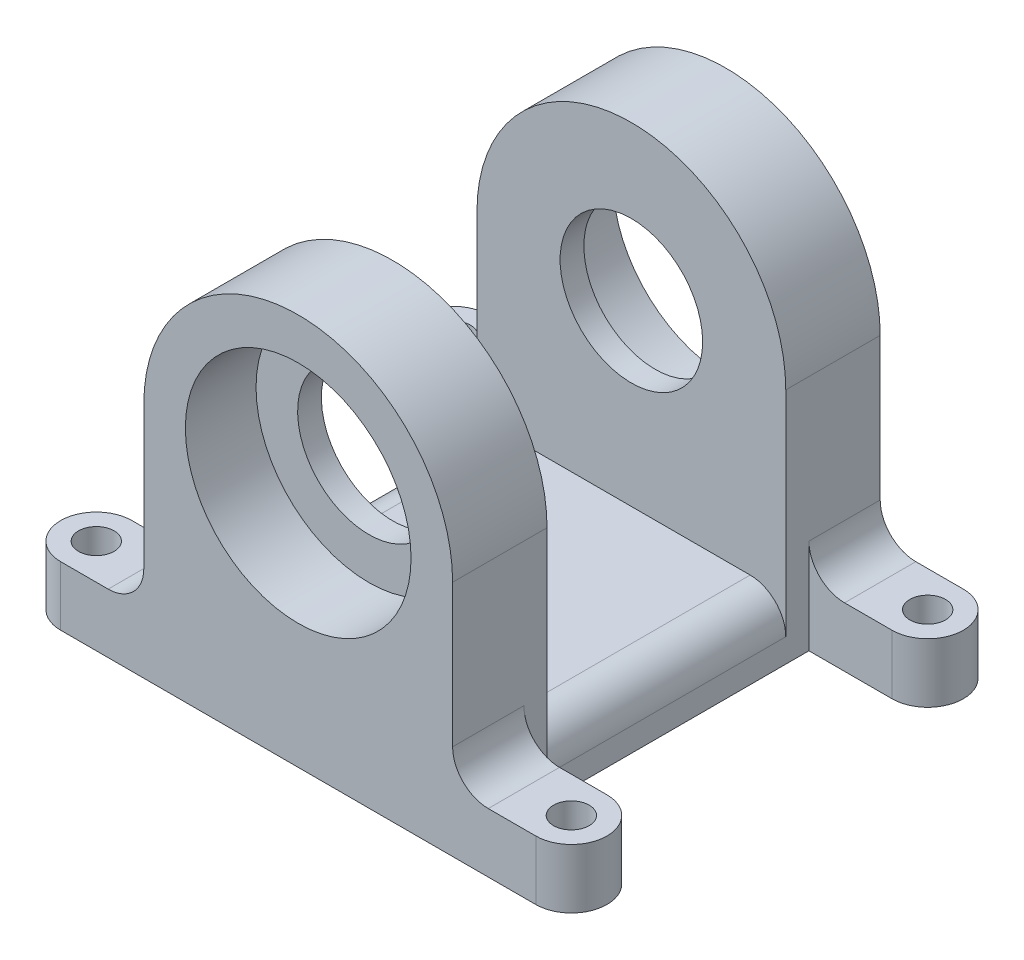
ISO-10303-21;
HEADER;
FILE_DESCRIPTION(('STEP AP214'),'2;1');
FILE_NAME('part.step','',(''),(''),'','','');
FILE_SCHEMA(('AUTOMOTIVE_DESIGN { 1 0 10303 214 1 1 1 1 }'));
ENDSEC;
DATA;
#1=APPLICATION_CONTEXT('core data for automotive mechanical design processes');
#2=APPLICATION_PROTOCOL_DEFINITION('international standard','automotive_design',2000,#1);
#3=PRODUCT_CONTEXT('',#1,'mechanical');
#4=PRODUCT('Part','Part','',(#3));
#5=PRODUCT_RELATED_PRODUCT_CATEGORY('part','',(#4));
#6=PRODUCT_DEFINITION_FORMATION('','',#4);
#7=PRODUCT_DEFINITION_CONTEXT('part definition',#1,'design');
#8=PRODUCT_DEFINITION('design','',#6,#7);
#9=PRODUCT_DEFINITION_SHAPE('','',#8);
#10=(LENGTH_UNIT() NAMED_UNIT(*) SI_UNIT(.MILLI.,.METRE.));
#11=(NAMED_UNIT(*) PLANE_ANGLE_UNIT() SI_UNIT($,.RADIAN.));
#12=(NAMED_UNIT(*) SI_UNIT($,.STERADIAN.) SOLID_ANGLE_UNIT());
#13=UNCERTAINTY_MEASURE_WITH_UNIT(LENGTH_MEASURE(1.E-05),#10,'distance_accuracy_value','');
#14=(GEOMETRIC_REPRESENTATION_CONTEXT(3) GLOBAL_UNCERTAINTY_ASSIGNED_CONTEXT((#13)) GLOBAL_UNIT_ASSIGNED_CONTEXT((#10,
#11,#12)) REPRESENTATION_CONTEXT('',''));
#15=CARTESIAN_POINT('',(0.,0.,0.));
#16=DIRECTION('',(0.,0.,1.));
#17=DIRECTION('',(1.,0.,0.));
#18=AXIS2_PLACEMENT_3D('',#15,#16,#17);
#19=CARTESIAN_POINT('',(0.,0.,36.));
#20=DIRECTION('',(0.,0.,-1.));
#21=DIRECTION('',(-1.,0.,0.));
#22=AXIS2_PLACEMENT_3D('',#19,#20,#21);
#23=CYLINDRICAL_SURFACE('',#22,9.5);
#24=CARTESIAN_POINT('',(0.,0.,0.));
#25=DIRECTION('',(0.,0.,1.));
#26=DIRECTION('',(1.,0.,0.));
#27=AXIS2_PLACEMENT_3D('',#24,#25,#26);
#28=CIRCLE('',#27,9.5);
#29=CARTESIAN_POINT('',(9.5,0.,0.));
#30=VERTEX_POINT('',#29);
#31=EDGE_CURVE('E345',#30,#30,#28,.T.);
#32=ORIENTED_EDGE('',*,*,#31,.F.);
#33=EDGE_LOOP('',(#32));
#34=FACE_BOUND('',#33,.T.);
#35=CARTESIAN_POINT('',(0.,0.,5.95));
#36=DIRECTION('',(0.,0.,1.));
#37=DIRECTION('',(1.,0.,0.));
#38=AXIS2_PLACEMENT_3D('',#35,#36,#37);
#39=CIRCLE('',#38,9.5);
#40=CARTESIAN_POINT('',(9.5,0.,5.95));
#41=VERTEX_POINT('',#40);
#42=EDGE_CURVE('E314',#41,#41,#39,.T.);
#43=ORIENTED_EDGE('',*,*,#42,.T.);
#44=EDGE_LOOP('',(#43));
#45=FACE_BOUND('',#44,.T.);
#46=ADVANCED_FACE('F39',(#34,#45),#23,.F.);
#47=CARTESIAN_POINT('',(0.,0.,36.));
#48=DIRECTION('',(0.,0.,1.));
#49=DIRECTION('',(1.,0.,0.));
#50=AXIS2_PLACEMENT_3D('',#47,#48,#49);
#51=CIRCLE('',#50,9.5);
#52=CARTESIAN_POINT('',(9.5,0.,36.));
#53=VERTEX_POINT('',#52);
#54=EDGE_CURVE('E346',#53,#53,#51,.T.);
#55=ORIENTED_EDGE('',*,*,#54,.T.);
#56=EDGE_LOOP('',(#55));
#57=FACE_BOUND('',#56,.T.);
#58=CARTESIAN_POINT('',(0.,0.,30.05));
#59=DIRECTION('',(0.,0.,-1.));
#60=DIRECTION('',(0.,1.,0.));
#61=AXIS2_PLACEMENT_3D('',#58,#59,#60);
#62=CIRCLE('',#61,9.5);
#63=CARTESIAN_POINT('',(0.,9.49999999999999,30.05));
#64=VERTEX_POINT('',#63);
#65=EDGE_CURVE('E323',#64,#64,#62,.T.);
#66=ORIENTED_EDGE('',*,*,#65,.T.);
#67=EDGE_LOOP('',(#66));
#68=FACE_BOUND('',#67,.T.);
#69=ADVANCED_FACE('F513',(#57,#68),#23,.F.);
#70=CARTESIAN_POINT('',(0.,0.,36.));
#71=DIRECTION('',(0.,0.,-1.));
#72=DIRECTION('',(-1.,0.,0.));
#73=AXIS2_PLACEMENT_3D('',#70,#71,#72);
#74=CYLINDRICAL_SURFACE('',#73,13.);
#75=DIRECTION('',(0.,0.,-1.));
#76=VECTOR('',#75,1.);
#77=CARTESIAN_POINT('',(13.,0.,36.));
#78=LINE('',#77,#76);
#79=CARTESIAN_POINT('',(13.,0.,36.));
#80=VERTEX_POINT('',#79);
#81=CARTESIAN_POINT('',(13.,0.,28.05));
#82=VERTEX_POINT('',#81);
#83=EDGE_CURVE('E371',#80,#82,#78,.T.);
#84=ORIENTED_EDGE('',*,*,#83,.T.);
#85=CARTESIAN_POINT('',(0.,0.,28.05));
#86=DIRECTION('',(0.,0.,1.));
#87=DIRECTION('',(0.,-1.,0.));
#88=AXIS2_PLACEMENT_3D('',#85,#86,#87);
#89=CIRCLE('',#88,13.);
#90=CARTESIAN_POINT('',(-13.,0.,28.05));
#91=VERTEX_POINT('',#90);
#92=EDGE_CURVE('E343',#82,#91,#89,.T.);
#93=ORIENTED_EDGE('',*,*,#92,.T.);
#94=DIRECTION('',(0.,0.,-1.));
#95=VECTOR('',#94,1.);
#96=CARTESIAN_POINT('',(-13.,0.,36.));
#97=LINE('',#96,#95);
#98=CARTESIAN_POINT('',(-13.,0.,36.));
#99=VERTEX_POINT('',#98);
#100=EDGE_CURVE('E380',#99,#91,#97,.T.);
#101=ORIENTED_EDGE('',*,*,#100,.F.);
#102=CARTESIAN_POINT('',(0.,0.,36.));
#103=DIRECTION('',(0.,0.,1.));
#104=DIRECTION('',(1.,0.,0.));
#105=AXIS2_PLACEMENT_3D('',#102,#103,#104);
#106=CIRCLE('',#105,13.);
#107=EDGE_CURVE('E352',#80,#99,#106,.T.);
#108=ORIENTED_EDGE('',*,*,#107,.F.);
#109=EDGE_LOOP('',(#84,#93,#101,#108));
#110=FACE_BOUND('',#109,.T.);
#111=ADVANCED_FACE('F459',(#110),#74,.T.);
#112=CARTESIAN_POINT('',(0.,0.,36.));
#113=DIRECTION('',(0.,0.,1.));
#114=DIRECTION('',(1.,0.,0.));
#115=AXIS2_PLACEMENT_3D('',#112,#113,#114);
#116=PLANE('',#115);
#117=ORIENTED_EDGE('',*,*,#107,.T.);
#118=DIRECTION('',(0.,-1.,0.));
#119=VECTOR('',#118,1.);
#120=CARTESIAN_POINT('',(-13.,0.,36.));
#121=LINE('',#120,#119);
#122=CARTESIAN_POINT('',(-13.,-12.,36.));
#123=VERTEX_POINT('',#122);
#124=EDGE_CURVE('E355',#99,#123,#121,.T.);
#125=ORIENTED_EDGE('',*,*,#124,.T.);
#126=CARTESIAN_POINT('',(-16.,-12.,36.));
#127=DIRECTION('',(0.,0.,1.));
#128=DIRECTION('',(1.,0.,0.));
#129=AXIS2_PLACEMENT_3D('',#126,#127,#128);
#130=CIRCLE('',#129,3.);
#131=CARTESIAN_POINT('',(-16.,-15.,36.));
#132=VERTEX_POINT('',#131);
#133=EDGE_CURVE('E415',#123,#132,#130,.F.);
#134=ORIENTED_EDGE('',*,*,#133,.T.);
#135=DIRECTION('',(-1.,0.,0.));
#136=VECTOR('',#135,1.);
#137=CARTESIAN_POINT('',(-13.,-15.,36.));
#138=LINE('',#137,#136);
#139=CARTESIAN_POINT('',(-20.,-15.,36.));
#140=VERTEX_POINT('',#139);
#141=EDGE_CURVE('E285',#132,#140,#138,.T.);
#142=ORIENTED_EDGE('',*,*,#141,.T.);
#143=DIRECTION('',(0.,-1.,0.));
#144=VECTOR('',#143,1.);
#145=CARTESIAN_POINT('',(-20.,-15.,36.));
#146=LINE('',#145,#144);
#147=CARTESIAN_POINT('',(-20.,-20.,36.));
#148=VERTEX_POINT('',#147);
#149=EDGE_CURVE('E272',#140,#148,#146,.T.);
#150=ORIENTED_EDGE('',*,*,#149,.T.);
#151=DIRECTION('',(1.,0.,0.));
#152=VECTOR('',#151,1.);
#153=CARTESIAN_POINT('',(-13.,-20.,36.));
#154=LINE('',#153,#152);
#155=CARTESIAN_POINT('',(20.,-20.,36.));
#156=VERTEX_POINT('',#155);
#157=EDGE_CURVE('E359',#148,#156,#154,.T.);
#158=ORIENTED_EDGE('',*,*,#157,.T.);
#159=DIRECTION('',(0.,-1.,0.));
#160=VECTOR('',#159,1.);
#161=CARTESIAN_POINT('',(20.,-15.,36.));
#162=LINE('',#161,#160);
#163=CARTESIAN_POINT('',(20.,-15.,36.));
#164=VERTEX_POINT('',#163);
#165=EDGE_CURVE('E303',#164,#156,#162,.T.);
#166=ORIENTED_EDGE('',*,*,#165,.F.);
#167=DIRECTION('',(-1.,0.,0.));
#168=VECTOR('',#167,1.);
#169=CARTESIAN_POINT('',(13.,-15.,36.));
#170=LINE('',#169,#168);
#171=CARTESIAN_POINT('',(16.,-15.,36.));
#172=VERTEX_POINT('',#171);
#173=EDGE_CURVE('E295',#164,#172,#170,.T.);
#174=ORIENTED_EDGE('',*,*,#173,.T.);
#175=CARTESIAN_POINT('',(16.,-12.,36.));
#176=DIRECTION('',(0.,0.,1.));
#177=DIRECTION('',(1.,0.,0.));
#178=AXIS2_PLACEMENT_3D('',#175,#176,#177);
#179=CIRCLE('',#178,3.);
#180=CARTESIAN_POINT('',(13.,-12.,36.));
#181=VERTEX_POINT('',#180);
#182=EDGE_CURVE('E430',#172,#181,#179,.F.);
#183=ORIENTED_EDGE('',*,*,#182,.T.);
#184=DIRECTION('',(0.,1.,0.));
#185=VECTOR('',#184,1.);
#186=CARTESIAN_POINT('',(13.,-20.,36.));
#187=LINE('',#186,#185);
#188=EDGE_CURVE('E361',#181,#80,#187,.T.);
#189=ORIENTED_EDGE('',*,*,#188,.T.);
#190=EDGE_LOOP('',(#117,#125,#134,#142,#150,#158,#166,#174,#183,#189));
#191=FACE_BOUND('',#190,.T.);
#192=ORIENTED_EDGE('',*,*,#54,.F.);
#193=EDGE_LOOP('',(#192));
#194=FACE_BOUND('',#193,.T.);
#195=ADVANCED_FACE('F463',(#191,#194),#116,.T.);
#196=CARTESIAN_POINT('',(0.,0.,0.));
#197=DIRECTION('',(0.,0.,1.));
#198=DIRECTION('',(1.,0.,0.));
#199=AXIS2_PLACEMENT_3D('',#196,#197,#198);
#200=PLANE('',#199);
#201=CARTESIAN_POINT('',(0.,0.,0.));
#202=DIRECTION('',(0.,0.,1.));
#203=DIRECTION('',(1.,0.,0.));
#204=AXIS2_PLACEMENT_3D('',#201,#202,#203);
#205=CIRCLE('',#204,13.);
#206=CARTESIAN_POINT('',(13.,0.,0.));
#207=VERTEX_POINT('',#206);
#208=CARTESIAN_POINT('',(-13.,0.,0.));
#209=VERTEX_POINT('',#208);
#210=EDGE_CURVE('E349',#207,#209,#205,.T.);
#211=ORIENTED_EDGE('',*,*,#210,.F.);
#212=DIRECTION('',(0.,1.,0.));
#213=VECTOR('',#212,1.);
#214=CARTESIAN_POINT('',(13.,-20.,0.));
#215=LINE('',#214,#213);
#216=CARTESIAN_POINT('',(13.,-12.,0.));
#217=VERTEX_POINT('',#216);
#218=EDGE_CURVE('E356',#217,#207,#215,.T.);
#219=ORIENTED_EDGE('',*,*,#218,.F.);
#220=CARTESIAN_POINT('',(16.,-12.,0.));
#221=DIRECTION('',(0.,0.,1.));
#222=DIRECTION('',(1.,0.,0.));
#223=AXIS2_PLACEMENT_3D('',#220,#221,#222);
#224=CIRCLE('',#223,3.);
#225=CARTESIAN_POINT('',(16.,-15.,0.));
#226=VERTEX_POINT('',#225);
#227=EDGE_CURVE('E424',#217,#226,#224,.T.);
#228=ORIENTED_EDGE('',*,*,#227,.T.);
#229=DIRECTION('',(1.,0.,0.));
#230=VECTOR('',#229,1.);
#231=CARTESIAN_POINT('',(13.,-15.,0.));
#232=LINE('',#231,#230);
#233=CARTESIAN_POINT('',(20.,-15.,0.));
#234=VERTEX_POINT('',#233);
#235=EDGE_CURVE('E238',#226,#234,#232,.T.);
#236=ORIENTED_EDGE('',*,*,#235,.T.);
#237=DIRECTION('',(0.,-1.,0.));
#238=VECTOR('',#237,1.);
#239=CARTESIAN_POINT('',(20.,-15.,0.));
#240=LINE('',#239,#238);
#241=CARTESIAN_POINT('',(20.,-20.,0.));
#242=VERTEX_POINT('',#241);
#243=EDGE_CURVE('E223',#234,#242,#240,.T.);
#244=ORIENTED_EDGE('',*,*,#243,.T.);
#245=DIRECTION('',(1.,0.,0.));
#246=VECTOR('',#245,1.);
#247=CARTESIAN_POINT('',(-13.,-20.,0.));
#248=LINE('',#247,#246);
#249=CARTESIAN_POINT('',(-20.,-20.,0.));
#250=VERTEX_POINT('',#249);
#251=EDGE_CURVE('E231',#250,#242,#248,.T.);
#252=ORIENTED_EDGE('',*,*,#251,.F.);
#253=DIRECTION('',(0.,-1.,0.));
#254=VECTOR('',#253,1.);
#255=CARTESIAN_POINT('',(-20.,-15.,0.));
#256=LINE('',#255,#254);
#257=CARTESIAN_POINT('',(-20.,-15.,0.));
#258=VERTEX_POINT('',#257);
#259=EDGE_CURVE('E252',#258,#250,#256,.T.);
#260=ORIENTED_EDGE('',*,*,#259,.F.);
#261=DIRECTION('',(1.,0.,0.));
#262=VECTOR('',#261,1.);
#263=CARTESIAN_POINT('',(-13.,-15.,0.));
#264=LINE('',#263,#262);
#265=CARTESIAN_POINT('',(-16.,-15.,0.));
#266=VERTEX_POINT('',#265);
#267=EDGE_CURVE('E249',#258,#266,#264,.T.);
#268=ORIENTED_EDGE('',*,*,#267,.T.);
#269=CARTESIAN_POINT('',(-16.,-12.,0.));
#270=DIRECTION('',(0.,0.,1.));
#271=DIRECTION('',(1.,0.,0.));
#272=AXIS2_PLACEMENT_3D('',#269,#270,#271);
#273=CIRCLE('',#272,3.);
#274=CARTESIAN_POINT('',(-13.,-12.,0.));
#275=VERTEX_POINT('',#274);
#276=EDGE_CURVE('E422',#266,#275,#273,.T.);
#277=ORIENTED_EDGE('',*,*,#276,.T.);
#278=DIRECTION('',(0.,-1.,0.));
#279=VECTOR('',#278,1.);
#280=CARTESIAN_POINT('',(-13.,0.,0.));
#281=LINE('',#280,#279);
#282=EDGE_CURVE('E366',#209,#275,#281,.T.);
#283=ORIENTED_EDGE('',*,*,#282,.F.);
#284=EDGE_LOOP('',(#211,#219,#228,#236,#244,#252,#260,#268,#277,#283));
#285=FACE_BOUND('',#284,.T.);
#286=ORIENTED_EDGE('',*,*,#31,.T.);
#287=EDGE_LOOP('',(#286));
#288=FACE_BOUND('',#287,.T.);
#289=ADVANCED_FACE('F492',(#285,#288),#200,.F.);
#290=CARTESIAN_POINT('',(-13.,0.,7.95));
#291=VERTEX_POINT('',#290);
#292=EDGE_CURVE('E379',#291,#209,#97,.T.);
#293=ORIENTED_EDGE('',*,*,#292,.F.);
#294=CARTESIAN_POINT('',(0.,0.,7.95));
#295=DIRECTION('',(0.,0.,-1.));
#296=DIRECTION('',(-1.,0.,0.));
#297=AXIS2_PLACEMENT_3D('',#294,#295,#296);
#298=CIRCLE('',#297,13.);
#299=CARTESIAN_POINT('',(13.,0.,7.95));
#300=VERTEX_POINT('',#299);
#301=EDGE_CURVE('E339',#291,#300,#298,.T.);
#302=ORIENTED_EDGE('',*,*,#301,.T.);
#303=EDGE_CURVE('E363',#300,#207,#78,.T.);
#304=ORIENTED_EDGE('',*,*,#303,.T.);
#305=ORIENTED_EDGE('',*,*,#210,.T.);
#306=EDGE_LOOP('',(#293,#302,#304,#305));
#307=FACE_BOUND('',#306,.T.);
#308=ADVANCED_FACE('F532',(#307),#74,.T.);
#309=CARTESIAN_POINT('',(-13.,0.,36.));
#310=DIRECTION('',(1.,0.,0.));
#311=DIRECTION('',(0.,1.,0.));
#312=AXIS2_PLACEMENT_3D('',#309,#310,#311);
#313=PLANE('',#312);
#314=DIRECTION('',(0.,0.,-1.));
#315=VECTOR('',#314,1.);
#316=CARTESIAN_POINT('',(-13.,-18.,36.));
#317=LINE('',#316,#315);
#318=CARTESIAN_POINT('',(-13.,-18.,28.05));
#319=VERTEX_POINT('',#318);
#320=CARTESIAN_POINT('',(-13.,-18.,7.95));
#321=VERTEX_POINT('',#320);
#322=EDGE_CURVE('E432',#319,#321,#317,.T.);
#323=ORIENTED_EDGE('',*,*,#322,.T.);
#324=DIRECTION('',(0.,1.,0.));
#325=VECTOR('',#324,1.);
#326=CARTESIAN_POINT('',(-13.,-15.,7.95));
#327=LINE('',#326,#325);
#328=EDGE_CURVE('E328',#321,#291,#327,.T.);
#329=ORIENTED_EDGE('',*,*,#328,.T.);
#330=ORIENTED_EDGE('',*,*,#292,.T.);
#331=ORIENTED_EDGE('',*,*,#282,.T.);
#332=DIRECTION('',(0.,0.,1.));
#333=VECTOR('',#332,1.);
#334=CARTESIAN_POINT('',(-13.,-12.,36.));
#335=LINE('',#334,#333);
#336=CARTESIAN_POINT('',(-13.,-12.,6.));
#337=VERTEX_POINT('',#336);
#338=EDGE_CURVE('E383',#275,#337,#335,.T.);
#339=ORIENTED_EDGE('',*,*,#338,.T.);
#340=DIRECTION('',(0.,-1.,0.));
#341=VECTOR('',#340,1.);
#342=CARTESIAN_POINT('',(-13.,-15.,6.));
#343=LINE('',#342,#341);
#344=CARTESIAN_POINT('',(-13.,-20.,6.));
#345=VERTEX_POINT('',#344);
#346=EDGE_CURVE('E246',#337,#345,#343,.T.);
#347=ORIENTED_EDGE('',*,*,#346,.T.);
#348=DIRECTION('',(0.,0.,-1.));
#349=VECTOR('',#348,1.);
#350=CARTESIAN_POINT('',(-13.,-20.,36.));
#351=LINE('',#350,#349);
#352=CARTESIAN_POINT('',(-13.,-20.,30.));
#353=VERTEX_POINT('',#352);
#354=EDGE_CURVE('E376',#353,#345,#351,.T.);
#355=ORIENTED_EDGE('',*,*,#354,.F.);
#356=DIRECTION('',(0.,-1.,0.));
#357=VECTOR('',#356,1.);
#358=CARTESIAN_POINT('',(-13.,-15.,30.));
#359=LINE('',#358,#357);
#360=CARTESIAN_POINT('',(-13.,-12.,30.));
#361=VERTEX_POINT('',#360);
#362=EDGE_CURVE('E268',#361,#353,#359,.T.);
#363=ORIENTED_EDGE('',*,*,#362,.F.);
#364=DIRECTION('',(0.,0.,1.));
#365=VECTOR('',#364,1.);
#366=CARTESIAN_POINT('',(-13.,-12.,36.));
#367=LINE('',#366,#365);
#368=EDGE_CURVE('E398',#361,#123,#367,.T.);
#369=ORIENTED_EDGE('',*,*,#368,.T.);
#370=ORIENTED_EDGE('',*,*,#124,.F.);
#371=ORIENTED_EDGE('',*,*,#100,.T.);
#372=DIRECTION('',(0.,-1.,0.));
#373=VECTOR('',#372,1.);
#374=CARTESIAN_POINT('',(-13.,13.,28.05));
#375=LINE('',#374,#373);
#376=EDGE_CURVE('E331',#91,#319,#375,.T.);
#377=ORIENTED_EDGE('',*,*,#376,.T.);
#378=EDGE_LOOP('',(#323,#329,#330,#331,#339,#347,#355,#363,#369,#370,#371,#377));
#379=FACE_BOUND('',#378,.T.);
#380=ADVANCED_FACE('F538',(#379),#313,.F.);
#381=CARTESIAN_POINT('',(-13.,-20.,36.));
#382=DIRECTION('',(0.,1.,0.));
#383=DIRECTION('',(0.,0.,1.));
#384=AXIS2_PLACEMENT_3D('',#381,#382,#383);
#385=PLANE('',#384);
#386=CARTESIAN_POINT('',(20.,-20.,33.));
#387=DIRECTION('',(0.,-1.,0.));
#388=DIRECTION('',(0.,0.,-1.));
#389=AXIS2_PLACEMENT_3D('',#386,#387,#388);
#390=CIRCLE('',#389,1.5);
#391=CARTESIAN_POINT('',(20.,-20.,31.5));
#392=VERTEX_POINT('',#391);
#393=EDGE_CURVE('E648',#392,#392,#390,.T.);
#394=ORIENTED_EDGE('',*,*,#393,.F.);
#395=EDGE_LOOP('',(#394));
#396=FACE_BOUND('',#395,.T.);
#397=CARTESIAN_POINT('',(-20.,-20.,3.));
#398=DIRECTION('',(0.,-1.,0.));
#399=DIRECTION('',(0.,0.,-1.));
#400=AXIS2_PLACEMENT_3D('',#397,#398,#399);
#401=CIRCLE('',#400,1.5);
#402=CARTESIAN_POINT('',(-20.,-20.,1.5));
#403=VERTEX_POINT('',#402);
#404=EDGE_CURVE('E649',#403,#403,#401,.T.);
#405=ORIENTED_EDGE('',*,*,#404,.F.);
#406=EDGE_LOOP('',(#405));
#407=FACE_BOUND('',#406,.T.);
#408=CARTESIAN_POINT('',(20.,-20.,3.));
#409=DIRECTION('',(0.,-1.,0.));
#410=DIRECTION('',(0.,0.,-1.));
#411=AXIS2_PLACEMENT_3D('',#408,#409,#410);
#412=CIRCLE('',#411,1.5);
#413=CARTESIAN_POINT('',(20.,-20.,1.5));
#414=VERTEX_POINT('',#413);
#415=EDGE_CURVE('E652',#414,#414,#412,.T.);
#416=ORIENTED_EDGE('',*,*,#415,.F.);
#417=EDGE_LOOP('',(#416));
#418=FACE_BOUND('',#417,.T.);
#419=CARTESIAN_POINT('',(-20.,-20.,33.));
#420=DIRECTION('',(0.,-1.,0.));
#421=DIRECTION('',(0.,0.,-1.));
#422=AXIS2_PLACEMENT_3D('',#419,#420,#421);
#423=CIRCLE('',#422,1.5);
#424=CARTESIAN_POINT('',(-20.,-20.,31.5));
#425=VERTEX_POINT('',#424);
#426=EDGE_CURVE('E388',#425,#425,#423,.T.);
#427=ORIENTED_EDGE('',*,*,#426,.F.);
#428=EDGE_LOOP('',(#427));
#429=FACE_BOUND('',#428,.T.);
#430=ORIENTED_EDGE('',*,*,#251,.T.);
#431=CARTESIAN_POINT('',(20.,-20.,3.));
#432=DIRECTION('',(0.,-1.,0.));
#433=DIRECTION('',(0.,0.,-1.));
#434=AXIS2_PLACEMENT_3D('',#431,#432,#433);
#435=CIRCLE('',#434,3.);
#436=CARTESIAN_POINT('',(20.,-20.,6.));
#437=VERTEX_POINT('',#436);
#438=EDGE_CURVE('E216',#242,#437,#435,.T.);
#439=ORIENTED_EDGE('',*,*,#438,.T.);
#440=DIRECTION('',(-1.,0.,0.));
#441=VECTOR('',#440,1.);
#442=CARTESIAN_POINT('',(20.,-20.,6.));
#443=LINE('',#442,#441);
#444=CARTESIAN_POINT('',(13.,-20.,6.));
#445=VERTEX_POINT('',#444);
#446=EDGE_CURVE('E229',#437,#445,#443,.T.);
#447=ORIENTED_EDGE('',*,*,#446,.T.);
#448=DIRECTION('',(0.,0.,-1.));
#449=VECTOR('',#448,1.);
#450=CARTESIAN_POINT('',(13.,-20.,36.));
#451=LINE('',#450,#449);
#452=CARTESIAN_POINT('',(13.,-20.,30.));
#453=VERTEX_POINT('',#452);
#454=EDGE_CURVE('E374',#453,#445,#451,.T.);
#455=ORIENTED_EDGE('',*,*,#454,.F.);
#456=DIRECTION('',(1.,0.,0.));
#457=VECTOR('',#456,1.);
#458=CARTESIAN_POINT('',(20.,-20.,30.));
#459=LINE('',#458,#457);
#460=CARTESIAN_POINT('',(20.,-20.,30.));
#461=VERTEX_POINT('',#460);
#462=EDGE_CURVE('E233',#453,#461,#459,.T.);
#463=ORIENTED_EDGE('',*,*,#462,.T.);
#464=CARTESIAN_POINT('',(20.,-20.,33.));
#465=DIRECTION('',(0.,-1.,0.));
#466=DIRECTION('',(0.,0.,1.));
#467=AXIS2_PLACEMENT_3D('',#464,#465,#466);
#468=CIRCLE('',#467,3.);
#469=EDGE_CURVE('E292',#461,#156,#468,.T.);
#470=ORIENTED_EDGE('',*,*,#469,.T.);
#471=ORIENTED_EDGE('',*,*,#157,.F.);
#472=CARTESIAN_POINT('',(-20.,-20.,33.));
#473=DIRECTION('',(0.,-1.,0.));
#474=DIRECTION('',(0.,0.,-1.));
#475=AXIS2_PLACEMENT_3D('',#472,#473,#474);
#476=CIRCLE('',#475,3.);
#477=CARTESIAN_POINT('',(-20.,-20.,30.));
#478=VERTEX_POINT('',#477);
#479=EDGE_CURVE('E278',#148,#478,#476,.T.);
#480=ORIENTED_EDGE('',*,*,#479,.T.);
#481=DIRECTION('',(1.,0.,0.));
#482=VECTOR('',#481,1.);
#483=CARTESIAN_POINT('',(-20.,-20.,30.));
#484=LINE('',#483,#482);
#485=EDGE_CURVE('E255',#478,#353,#484,.T.);
#486=ORIENTED_EDGE('',*,*,#485,.T.);
#487=ORIENTED_EDGE('',*,*,#354,.T.);
#488=DIRECTION('',(-1.,0.,0.));
#489=VECTOR('',#488,1.);
#490=CARTESIAN_POINT('',(-20.,-20.,6.));
#491=LINE('',#490,#489);
#492=CARTESIAN_POINT('',(-20.,-20.,6.));
#493=VERTEX_POINT('',#492);
#494=EDGE_CURVE('E258',#345,#493,#491,.T.);
#495=ORIENTED_EDGE('',*,*,#494,.T.);
#496=CARTESIAN_POINT('',(-20.,-20.,3.));
#497=DIRECTION('',(0.,-1.,0.));
#498=DIRECTION('',(0.,0.,1.));
#499=AXIS2_PLACEMENT_3D('',#496,#497,#498);
#500=CIRCLE('',#499,3.);
#501=EDGE_CURVE('E256',#493,#250,#500,.T.);
#502=ORIENTED_EDGE('',*,*,#501,.T.);
#503=EDGE_LOOP('',(#430,#439,#447,#455,#463,#470,#471,#480,#486,#487,#495,#502));
#504=FACE_BOUND('',#503,.T.);
#505=ADVANCED_FACE('F228',(#396,#407,#418,#429,#504),#385,.F.);
#506=CARTESIAN_POINT('',(13.,-20.,36.));
#507=DIRECTION('',(-1.,0.,0.));
#508=DIRECTION('',(0.,-1.,0.));
#509=AXIS2_PLACEMENT_3D('',#506,#507,#508);
#510=PLANE('',#509);
#511=DIRECTION('',(0.,1.,0.));
#512=VECTOR('',#511,1.);
#513=CARTESIAN_POINT('',(13.,-15.,7.95));
#514=LINE('',#513,#512);
#515=CARTESIAN_POINT('',(13.,-18.,7.95));
#516=VERTEX_POINT('',#515);
#517=EDGE_CURVE('E54',#516,#300,#514,.T.);
#518=ORIENTED_EDGE('',*,*,#517,.F.);
#519=DIRECTION('',(0.,0.,-1.));
#520=VECTOR('',#519,1.);
#521=CARTESIAN_POINT('',(13.,-18.,36.));
#522=LINE('',#521,#520);
#523=CARTESIAN_POINT('',(13.,-18.,28.05));
#524=VERTEX_POINT('',#523);
#525=EDGE_CURVE('E440',#516,#524,#522,.F.);
#526=ORIENTED_EDGE('',*,*,#525,.T.);
#527=DIRECTION('',(0.,-1.,0.));
#528=VECTOR('',#527,1.);
#529=CARTESIAN_POINT('',(13.,13.,28.05));
#530=LINE('',#529,#528);
#531=EDGE_CURVE('E61',#82,#524,#530,.T.);
#532=ORIENTED_EDGE('',*,*,#531,.F.);
#533=ORIENTED_EDGE('',*,*,#83,.F.);
#534=ORIENTED_EDGE('',*,*,#188,.F.);
#535=DIRECTION('',(0.,0.,-1.));
#536=VECTOR('',#535,1.);
#537=CARTESIAN_POINT('',(13.,-12.,36.));
#538=LINE('',#537,#536);
#539=CARTESIAN_POINT('',(13.,-12.,30.));
#540=VERTEX_POINT('',#539);
#541=EDGE_CURVE('E405',#181,#540,#538,.T.);
#542=ORIENTED_EDGE('',*,*,#541,.T.);
#543=DIRECTION('',(0.,-1.,0.));
#544=VECTOR('',#543,1.);
#545=CARTESIAN_POINT('',(13.,-15.,30.));
#546=LINE('',#545,#544);
#547=EDGE_CURVE('E298',#540,#453,#546,.T.);
#548=ORIENTED_EDGE('',*,*,#547,.T.);
#549=ORIENTED_EDGE('',*,*,#454,.T.);
#550=DIRECTION('',(0.,-1.,0.));
#551=VECTOR('',#550,1.);
#552=CARTESIAN_POINT('',(13.,-15.,6.));
#553=LINE('',#552,#551);
#554=CARTESIAN_POINT('',(13.,-12.,6.));
#555=VERTEX_POINT('',#554);
#556=EDGE_CURVE('E224',#555,#445,#553,.T.);
#557=ORIENTED_EDGE('',*,*,#556,.F.);
#558=DIRECTION('',(0.,0.,-1.));
#559=VECTOR('',#558,1.);
#560=CARTESIAN_POINT('',(13.,-12.,0.));
#561=LINE('',#560,#559);
#562=EDGE_CURVE('E408',#555,#217,#561,.T.);
#563=ORIENTED_EDGE('',*,*,#562,.T.);
#564=ORIENTED_EDGE('',*,*,#218,.T.);
#565=ORIENTED_EDGE('',*,*,#303,.F.);
#566=EDGE_LOOP('',(#518,#526,#532,#533,#534,#542,#548,#549,#557,#563,#564,#565));
#567=FACE_BOUND('',#566,.T.);
#568=ADVANCED_FACE('F454',(#567),#510,.F.);
#569=CARTESIAN_POINT('',(-13.,13.,28.05));
#570=DIRECTION('',(0.,0.,1.));
#571=DIRECTION('',(0.,-1.,0.));
#572=AXIS2_PLACEMENT_3D('',#569,#570,#571);
#573=PLANE('',#572);
#574=ORIENTED_EDGE('',*,*,#531,.T.);
#575=CARTESIAN_POINT('',(9.99999999999999,-18.,28.05));
#576=DIRECTION('',(0.,0.,1.));
#577=DIRECTION('',(0.,-1.,0.));
#578=AXIS2_PLACEMENT_3D('',#575,#576,#577);
#579=CIRCLE('',#578,3.);
#580=CARTESIAN_POINT('',(9.99999999999999,-15.,28.05));
#581=VERTEX_POINT('',#580);
#582=EDGE_CURVE('E11',#524,#581,#579,.T.);
#583=ORIENTED_EDGE('',*,*,#582,.T.);
#584=DIRECTION('',(1.,0.,0.));
#585=VECTOR('',#584,1.);
#586=CARTESIAN_POINT('',(-13.,-15.,28.05));
#587=LINE('',#586,#585);
#588=CARTESIAN_POINT('',(-9.99999999999999,-15.,28.05));
#589=VERTEX_POINT('',#588);
#590=EDGE_CURVE('E336',#589,#581,#587,.T.);
#591=ORIENTED_EDGE('',*,*,#590,.F.);
#592=CARTESIAN_POINT('',(-9.99999999999999,-18.,28.05));
#593=DIRECTION('',(0.,0.,1.));
#594=DIRECTION('',(0.,-1.,0.));
#595=AXIS2_PLACEMENT_3D('',#592,#593,#594);
#596=CIRCLE('',#595,3.);
#597=EDGE_CURVE('E444',#589,#319,#596,.T.);
#598=ORIENTED_EDGE('',*,*,#597,.T.);
#599=ORIENTED_EDGE('',*,*,#376,.F.);
#600=ORIENTED_EDGE('',*,*,#92,.F.);
#601=EDGE_LOOP('',(#574,#583,#591,#598,#599,#600));
#602=FACE_BOUND('',#601,.T.);
#603=CARTESIAN_POINT('',(0.,0.,28.05));
#604=DIRECTION('',(0.,0.,-1.));
#605=DIRECTION('',(0.,1.,0.));
#606=AXIS2_PLACEMENT_3D('',#603,#604,#605);
#607=CIRCLE('',#606,6.);
#608=CARTESIAN_POINT('',(0.,5.99999999999999,28.05));
#609=VERTEX_POINT('',#608);
#610=EDGE_CURVE('E319',#609,#609,#607,.T.);
#611=ORIENTED_EDGE('',*,*,#610,.F.);
#612=EDGE_LOOP('',(#611));
#613=FACE_BOUND('',#612,.T.);
#614=ADVANCED_FACE('F535',(#602,#613),#573,.F.);
#615=CARTESIAN_POINT('',(-13.,-15.,7.95));
#616=DIRECTION('',(0.,0.,-1.));
#617=DIRECTION('',(-1.,0.,0.));
#618=AXIS2_PLACEMENT_3D('',#615,#616,#617);
#619=PLANE('',#618);
#620=ORIENTED_EDGE('',*,*,#328,.F.);
#621=CARTESIAN_POINT('',(-9.99999999999999,-18.,7.95));
#622=DIRECTION('',(0.,0.,-1.));
#623=DIRECTION('',(-1.,0.,0.));
#624=AXIS2_PLACEMENT_3D('',#621,#622,#623);
#625=CIRCLE('',#624,3.);
#626=CARTESIAN_POINT('',(-9.99999999999999,-15.,7.95));
#627=VERTEX_POINT('',#626);
#628=EDGE_CURVE('E442',#321,#627,#625,.T.);
#629=ORIENTED_EDGE('',*,*,#628,.T.);
#630=DIRECTION('',(1.,0.,0.));
#631=VECTOR('',#630,1.);
#632=CARTESIAN_POINT('',(-13.,-15.,7.95));
#633=LINE('',#632,#631);
#634=CARTESIAN_POINT('',(9.99999999999999,-15.,7.95));
#635=VERTEX_POINT('',#634);
#636=EDGE_CURVE('E333',#627,#635,#633,.T.);
#637=ORIENTED_EDGE('',*,*,#636,.T.);
#638=CARTESIAN_POINT('',(9.99999999999999,-18.,7.95));
#639=DIRECTION('',(0.,0.,-1.));
#640=DIRECTION('',(-1.,0.,0.));
#641=AXIS2_PLACEMENT_3D('',#638,#639,#640);
#642=CIRCLE('',#641,3.);
#643=EDGE_CURVE('E47',#635,#516,#642,.T.);
#644=ORIENTED_EDGE('',*,*,#643,.T.);
#645=ORIENTED_EDGE('',*,*,#517,.T.);
#646=ORIENTED_EDGE('',*,*,#301,.F.);
#647=EDGE_LOOP('',(#620,#629,#637,#644,#645,#646));
#648=FACE_BOUND('',#647,.T.);
#649=CARTESIAN_POINT('',(0.,0.,7.95));
#650=DIRECTION('',(0.,0.,1.));
#651=DIRECTION('',(1.,0.,0.));
#652=AXIS2_PLACEMENT_3D('',#649,#650,#651);
#653=CIRCLE('',#652,6.);
#654=CARTESIAN_POINT('',(6.,0.,7.95));
#655=VERTEX_POINT('',#654);
#656=EDGE_CURVE('E306',#655,#655,#653,.T.);
#657=ORIENTED_EDGE('',*,*,#656,.F.);
#658=EDGE_LOOP('',(#657));
#659=FACE_BOUND('',#658,.T.);
#660=ADVANCED_FACE('F448',(#648,#659),#619,.F.);
#661=CARTESIAN_POINT('',(-13.,-15.,28.05));
#662=DIRECTION('',(0.,-1.,0.));
#663=DIRECTION('',(1.,0.,0.));
#664=AXIS2_PLACEMENT_3D('',#661,#662,#663);
#665=PLANE('',#664);
#666=ORIENTED_EDGE('',*,*,#636,.F.);
#667=DIRECTION('',(0.,0.,-1.));
#668=VECTOR('',#667,1.);
#669=CARTESIAN_POINT('',(-9.99999999999999,-15.,28.05));
#670=LINE('',#669,#668);
#671=EDGE_CURVE('E438',#627,#589,#670,.F.);
#672=ORIENTED_EDGE('',*,*,#671,.T.);
#673=ORIENTED_EDGE('',*,*,#590,.T.);
#674=DIRECTION('',(0.,0.,-1.));
#675=VECTOR('',#674,1.);
#676=CARTESIAN_POINT('',(9.99999999999999,-15.,28.05));
#677=LINE('',#676,#675);
#678=EDGE_CURVE('E435',#581,#635,#677,.T.);
#679=ORIENTED_EDGE('',*,*,#678,.T.);
#680=EDGE_LOOP('',(#666,#672,#673,#679));
#681=FACE_BOUND('',#680,.T.);
#682=ADVANCED_FACE('F526',(#681),#665,.F.);
#683=CARTESIAN_POINT('',(0.,0.,30.05));
#684=DIRECTION('',(0.,0.,-1.));
#685=DIRECTION('',(0.,1.,0.));
#686=AXIS2_PLACEMENT_3D('',#683,#684,#685);
#687=PLANE('',#686);
#688=CARTESIAN_POINT('',(0.,0.,30.05));
#689=DIRECTION('',(0.,0.,-1.));
#690=DIRECTION('',(0.,1.,0.));
#691=AXIS2_PLACEMENT_3D('',#688,#689,#690);
#692=CIRCLE('',#691,6.);
#693=CARTESIAN_POINT('',(0.,5.99999999999999,30.05));
#694=VERTEX_POINT('',#693);
#695=EDGE_CURVE('E320',#694,#694,#692,.T.);
#696=ORIENTED_EDGE('',*,*,#695,.T.);
#697=EDGE_LOOP('',(#696));
#698=FACE_BOUND('',#697,.T.);
#699=ORIENTED_EDGE('',*,*,#65,.F.);
#700=EDGE_LOOP('',(#699));
#701=FACE_BOUND('',#700,.T.);
#702=ADVANCED_FACE('F572',(#698,#701),#687,.F.);
#703=CARTESIAN_POINT('',(0.,0.,30.05));
#704=DIRECTION('',(0.,0.,-1.));
#705=DIRECTION('',(0.,1.,0.));
#706=AXIS2_PLACEMENT_3D('',#703,#704,#705);
#707=CYLINDRICAL_SURFACE('',#706,6.);
#708=ORIENTED_EDGE('',*,*,#695,.F.);
#709=EDGE_LOOP('',(#708));
#710=FACE_BOUND('',#709,.T.);
#711=ORIENTED_EDGE('',*,*,#610,.T.);
#712=EDGE_LOOP('',(#711));
#713=FACE_BOUND('',#712,.T.);
#714=ADVANCED_FACE('F577',(#710,#713),#707,.F.);
#715=CARTESIAN_POINT('',(0.,0.,5.95));
#716=DIRECTION('',(0.,0.,1.));
#717=DIRECTION('',(1.,0.,0.));
#718=AXIS2_PLACEMENT_3D('',#715,#716,#717);
#719=PLANE('',#718);
#720=CARTESIAN_POINT('',(0.,0.,5.95));
#721=DIRECTION('',(0.,0.,1.));
#722=DIRECTION('',(1.,0.,0.));
#723=AXIS2_PLACEMENT_3D('',#720,#721,#722);
#724=CIRCLE('',#723,6.);
#725=CARTESIAN_POINT('',(6.,0.,5.95));
#726=VERTEX_POINT('',#725);
#727=EDGE_CURVE('E311',#726,#726,#724,.T.);
#728=ORIENTED_EDGE('',*,*,#727,.T.);
#729=EDGE_LOOP('',(#728));
#730=FACE_BOUND('',#729,.T.);
#731=ORIENTED_EDGE('',*,*,#42,.F.);
#732=EDGE_LOOP('',(#731));
#733=FACE_BOUND('',#732,.T.);
#734=ADVANCED_FACE('F586',(#730,#733),#719,.F.);
#735=CARTESIAN_POINT('',(0.,0.,5.95));
#736=DIRECTION('',(0.,0.,1.));
#737=DIRECTION('',(1.,0.,0.));
#738=AXIS2_PLACEMENT_3D('',#735,#736,#737);
#739=CYLINDRICAL_SURFACE('',#738,6.);
#740=ORIENTED_EDGE('',*,*,#727,.F.);
#741=EDGE_LOOP('',(#740));
#742=FACE_BOUND('',#741,.T.);
#743=ORIENTED_EDGE('',*,*,#656,.T.);
#744=EDGE_LOOP('',(#743));
#745=FACE_BOUND('',#744,.T.);
#746=ADVANCED_FACE('F589',(#742,#745),#739,.F.);
#747=CARTESIAN_POINT('',(20.,-15.,33.));
#748=DIRECTION('',(0.,-1.,0.));
#749=DIRECTION('',(0.,0.,-1.));
#750=AXIS2_PLACEMENT_3D('',#747,#748,#749);
#751=CYLINDRICAL_SURFACE('',#750,3.);
#752=ORIENTED_EDGE('',*,*,#469,.F.);
#753=DIRECTION('',(0.,-1.,0.));
#754=VECTOR('',#753,1.);
#755=CARTESIAN_POINT('',(20.,-15.,30.));
#756=LINE('',#755,#754);
#757=CARTESIAN_POINT('',(20.,-15.,30.));
#758=VERTEX_POINT('',#757);
#759=EDGE_CURVE('E307',#758,#461,#756,.T.);
#760=ORIENTED_EDGE('',*,*,#759,.F.);
#761=CARTESIAN_POINT('',(20.,-15.,33.));
#762=DIRECTION('',(0.,-1.,0.));
#763=DIRECTION('',(0.,0.,1.));
#764=AXIS2_PLACEMENT_3D('',#761,#762,#763);
#765=CIRCLE('',#764,3.);
#766=EDGE_CURVE('E291',#758,#164,#765,.T.);
#767=ORIENTED_EDGE('',*,*,#766,.T.);
#768=ORIENTED_EDGE('',*,*,#165,.T.);
#769=EDGE_LOOP('',(#752,#760,#767,#768));
#770=FACE_BOUND('',#769,.T.);
#771=ADVANCED_FACE('F482',(#770),#751,.T.);
#772=CARTESIAN_POINT('',(20.,-15.,30.));
#773=DIRECTION('',(0.,0.,-1.));
#774=DIRECTION('',(-1.,0.,0.));
#775=AXIS2_PLACEMENT_3D('',#772,#773,#774);
#776=PLANE('',#775);
#777=ORIENTED_EDGE('',*,*,#462,.F.);
#778=ORIENTED_EDGE('',*,*,#547,.F.);
#779=CARTESIAN_POINT('',(16.,-12.,30.));
#780=DIRECTION('',(0.,0.,-1.));
#781=DIRECTION('',(-1.,0.,0.));
#782=AXIS2_PLACEMENT_3D('',#779,#780,#781);
#783=CIRCLE('',#782,3.);
#784=CARTESIAN_POINT('',(16.,-15.,30.));
#785=VERTEX_POINT('',#784);
#786=EDGE_CURVE('E428',#540,#785,#783,.F.);
#787=ORIENTED_EDGE('',*,*,#786,.T.);
#788=DIRECTION('',(1.,0.,0.));
#789=VECTOR('',#788,1.);
#790=CARTESIAN_POINT('',(20.,-15.,30.));
#791=LINE('',#790,#789);
#792=EDGE_CURVE('E289',#785,#758,#791,.T.);
#793=ORIENTED_EDGE('',*,*,#792,.T.);
#794=ORIENTED_EDGE('',*,*,#759,.T.);
#795=EDGE_LOOP('',(#777,#778,#787,#793,#794));
#796=FACE_BOUND('',#795,.T.);
#797=ADVANCED_FACE('F474',(#796),#776,.T.);
#798=CARTESIAN_POINT('',(20.,-15.,33.));
#799=DIRECTION('',(0.,1.,0.));
#800=DIRECTION('',(0.,0.,1.));
#801=AXIS2_PLACEMENT_3D('',#798,#799,#800);
#802=PLANE('',#801);
#803=CARTESIAN_POINT('',(20.,-15.,33.));
#804=DIRECTION('',(0.,1.,0.));
#805=DIRECTION('',(0.,0.,1.));
#806=AXIS2_PLACEMENT_3D('',#803,#804,#805);
#807=CIRCLE('',#806,1.5);
#808=CARTESIAN_POINT('',(20.,-15.,34.5));
#809=VERTEX_POINT('',#808);
#810=EDGE_CURVE('E277',#809,#809,#807,.T.);
#811=ORIENTED_EDGE('',*,*,#810,.F.);
#812=EDGE_LOOP('',(#811));
#813=FACE_BOUND('',#812,.T.);
#814=ORIENTED_EDGE('',*,*,#792,.F.);
#815=DIRECTION('',(0.,0.,-1.));
#816=VECTOR('',#815,1.);
#817=CARTESIAN_POINT('',(16.,-15.,33.));
#818=LINE('',#817,#816);
#819=EDGE_CURVE('E413',#785,#172,#818,.F.);
#820=ORIENTED_EDGE('',*,*,#819,.T.);
#821=ORIENTED_EDGE('',*,*,#173,.F.);
#822=ORIENTED_EDGE('',*,*,#766,.F.);
#823=EDGE_LOOP('',(#814,#820,#821,#822));
#824=FACE_BOUND('',#823,.T.);
#825=ADVANCED_FACE('F478',(#813,#824),#802,.T.);
#826=CARTESIAN_POINT('',(20.,-15.,6.));
#827=DIRECTION('',(0.,0.,1.));
#828=DIRECTION('',(1.,0.,0.));
#829=AXIS2_PLACEMENT_3D('',#826,#827,#828);
#830=PLANE('',#829);
#831=ORIENTED_EDGE('',*,*,#446,.F.);
#832=DIRECTION('',(0.,-1.,0.));
#833=VECTOR('',#832,1.);
#834=CARTESIAN_POINT('',(20.,-15.,6.));
#835=LINE('',#834,#833);
#836=CARTESIAN_POINT('',(20.,-15.,6.));
#837=VERTEX_POINT('',#836);
#838=EDGE_CURVE('E212',#837,#437,#835,.T.);
#839=ORIENTED_EDGE('',*,*,#838,.F.);
#840=DIRECTION('',(-1.,0.,0.));
#841=VECTOR('',#840,1.);
#842=CARTESIAN_POINT('',(20.,-15.,6.));
#843=LINE('',#842,#841);
#844=CARTESIAN_POINT('',(16.,-15.,6.));
#845=VERTEX_POINT('',#844);
#846=EDGE_CURVE('E243',#837,#845,#843,.T.);
#847=ORIENTED_EDGE('',*,*,#846,.T.);
#848=CARTESIAN_POINT('',(16.,-12.,6.));
#849=DIRECTION('',(0.,0.,1.));
#850=DIRECTION('',(1.,0.,0.));
#851=AXIS2_PLACEMENT_3D('',#848,#849,#850);
#852=CIRCLE('',#851,3.);
#853=EDGE_CURVE('E426',#845,#555,#852,.F.);
#854=ORIENTED_EDGE('',*,*,#853,.T.);
#855=ORIENTED_EDGE('',*,*,#556,.T.);
#856=EDGE_LOOP('',(#831,#839,#847,#854,#855));
#857=FACE_BOUND('',#856,.T.);
#858=ADVANCED_FACE('F236',(#857),#830,.T.);
#859=CARTESIAN_POINT('',(20.,-15.,3.));
#860=DIRECTION('',(0.,-1.,0.));
#861=DIRECTION('',(0.,0.,-1.));
#862=AXIS2_PLACEMENT_3D('',#859,#860,#861);
#863=CYLINDRICAL_SURFACE('',#862,3.);
#864=ORIENTED_EDGE('',*,*,#438,.F.);
#865=ORIENTED_EDGE('',*,*,#243,.F.);
#866=CARTESIAN_POINT('',(20.,-15.,3.));
#867=DIRECTION('',(0.,-1.,0.));
#868=DIRECTION('',(0.,0.,-1.));
#869=AXIS2_PLACEMENT_3D('',#866,#867,#868);
#870=CIRCLE('',#869,3.);
#871=EDGE_CURVE('E218',#234,#837,#870,.T.);
#872=ORIENTED_EDGE('',*,*,#871,.T.);
#873=ORIENTED_EDGE('',*,*,#838,.T.);
#874=EDGE_LOOP('',(#864,#865,#872,#873));
#875=FACE_BOUND('',#874,.T.);
#876=ADVANCED_FACE('F214',(#875),#863,.T.);
#877=CARTESIAN_POINT('',(20.,-15.,3.));
#878=DIRECTION('',(0.,-1.,0.));
#879=DIRECTION('',(0.,0.,-1.));
#880=AXIS2_PLACEMENT_3D('',#877,#878,#879);
#881=PLANE('',#880);
#882=CARTESIAN_POINT('',(20.,-15.,3.));
#883=DIRECTION('',(0.,-1.,0.));
#884=DIRECTION('',(0.,0.,-1.));
#885=AXIS2_PLACEMENT_3D('',#882,#883,#884);
#886=CIRCLE('',#885,1.5);
#887=CARTESIAN_POINT('',(20.,-15.,1.5));
#888=VERTEX_POINT('',#887);
#889=EDGE_CURVE('E391',#888,#888,#886,.T.);
#890=ORIENTED_EDGE('',*,*,#889,.T.);
#891=EDGE_LOOP('',(#890));
#892=FACE_BOUND('',#891,.T.);
#893=ORIENTED_EDGE('',*,*,#235,.F.);
#894=DIRECTION('',(0.,0.,-1.));
#895=VECTOR('',#894,1.);
#896=CARTESIAN_POINT('',(16.,-15.,6.));
#897=LINE('',#896,#895);
#898=EDGE_CURVE('E411',#226,#845,#897,.F.);
#899=ORIENTED_EDGE('',*,*,#898,.T.);
#900=ORIENTED_EDGE('',*,*,#846,.F.);
#901=ORIENTED_EDGE('',*,*,#871,.F.);
#902=EDGE_LOOP('',(#893,#899,#900,#901));
#903=FACE_BOUND('',#902,.T.);
#904=ADVANCED_FACE('F495',(#892,#903),#881,.F.);
#905=CARTESIAN_POINT('',(-20.,-15.,3.));
#906=DIRECTION('',(0.,-1.,0.));
#907=DIRECTION('',(0.,0.,-1.));
#908=AXIS2_PLACEMENT_3D('',#905,#906,#907);
#909=CYLINDRICAL_SURFACE('',#908,3.);
#910=ORIENTED_EDGE('',*,*,#501,.F.);
#911=DIRECTION('',(0.,-1.,0.));
#912=VECTOR('',#911,1.);
#913=CARTESIAN_POINT('',(-20.,-15.,6.));
#914=LINE('',#913,#912);
#915=CARTESIAN_POINT('',(-20.,-15.,6.));
#916=VERTEX_POINT('',#915);
#917=EDGE_CURVE('E250',#916,#493,#914,.T.);
#918=ORIENTED_EDGE('',*,*,#917,.F.);
#919=CARTESIAN_POINT('',(-20.,-15.,3.));
#920=DIRECTION('',(0.,-1.,0.));
#921=DIRECTION('',(0.,0.,1.));
#922=AXIS2_PLACEMENT_3D('',#919,#920,#921);
#923=CIRCLE('',#922,3.);
#924=EDGE_CURVE('E264',#916,#258,#923,.T.);
#925=ORIENTED_EDGE('',*,*,#924,.T.);
#926=ORIENTED_EDGE('',*,*,#259,.T.);
#927=EDGE_LOOP('',(#910,#918,#925,#926));
#928=FACE_BOUND('',#927,.T.);
#929=ADVANCED_FACE('F497',(#928),#909,.T.);
#930=CARTESIAN_POINT('',(-20.,-15.,6.));
#931=DIRECTION('',(0.,0.,1.));
#932=DIRECTION('',(1.,0.,0.));
#933=AXIS2_PLACEMENT_3D('',#930,#931,#932);
#934=PLANE('',#933);
#935=ORIENTED_EDGE('',*,*,#494,.F.);
#936=ORIENTED_EDGE('',*,*,#346,.F.);
#937=CARTESIAN_POINT('',(-16.,-12.,6.));
#938=DIRECTION('',(0.,0.,1.));
#939=DIRECTION('',(1.,0.,0.));
#940=AXIS2_PLACEMENT_3D('',#937,#938,#939);
#941=CIRCLE('',#940,3.);
#942=CARTESIAN_POINT('',(-16.,-15.,6.));
#943=VERTEX_POINT('',#942);
#944=EDGE_CURVE('E420',#337,#943,#941,.F.);
#945=ORIENTED_EDGE('',*,*,#944,.T.);
#946=DIRECTION('',(-1.,0.,0.));
#947=VECTOR('',#946,1.);
#948=CARTESIAN_POINT('',(-20.,-15.,6.));
#949=LINE('',#948,#947);
#950=EDGE_CURVE('E259',#943,#916,#949,.T.);
#951=ORIENTED_EDGE('',*,*,#950,.T.);
#952=ORIENTED_EDGE('',*,*,#917,.T.);
#953=EDGE_LOOP('',(#935,#936,#945,#951,#952));
#954=FACE_BOUND('',#953,.T.);
#955=ADVANCED_FACE('F505',(#954),#934,.T.);
#956=CARTESIAN_POINT('',(-20.,-15.,3.));
#957=DIRECTION('',(0.,1.,0.));
#958=DIRECTION('',(0.,0.,1.));
#959=AXIS2_PLACEMENT_3D('',#956,#957,#958);
#960=PLANE('',#959);
#961=CARTESIAN_POINT('',(-20.,-15.,3.));
#962=DIRECTION('',(0.,1.,0.));
#963=DIRECTION('',(0.,0.,1.));
#964=AXIS2_PLACEMENT_3D('',#961,#962,#963);
#965=CIRCLE('',#964,1.5);
#966=CARTESIAN_POINT('',(-20.,-15.,4.5));
#967=VERTEX_POINT('',#966);
#968=EDGE_CURVE('E387',#967,#967,#965,.T.);
#969=ORIENTED_EDGE('',*,*,#968,.F.);
#970=EDGE_LOOP('',(#969));
#971=FACE_BOUND('',#970,.T.);
#972=ORIENTED_EDGE('',*,*,#950,.F.);
#973=DIRECTION('',(0.,0.,1.));
#974=VECTOR('',#973,1.);
#975=CARTESIAN_POINT('',(-16.,-15.,3.));
#976=LINE('',#975,#974);
#977=EDGE_CURVE('E403',#943,#266,#976,.F.);
#978=ORIENTED_EDGE('',*,*,#977,.T.);
#979=ORIENTED_EDGE('',*,*,#267,.F.);
#980=ORIENTED_EDGE('',*,*,#924,.F.);
#981=EDGE_LOOP('',(#972,#978,#979,#980));
#982=FACE_BOUND('',#981,.T.);
#983=ADVANCED_FACE('F613',(#971,#982),#960,.T.);
#984=CARTESIAN_POINT('',(-20.,-15.,30.));
#985=DIRECTION('',(0.,0.,-1.));
#986=DIRECTION('',(-1.,0.,0.));
#987=AXIS2_PLACEMENT_3D('',#984,#985,#986);
#988=PLANE('',#987);
#989=ORIENTED_EDGE('',*,*,#485,.F.);
#990=DIRECTION('',(0.,-1.,0.));
#991=VECTOR('',#990,1.);
#992=CARTESIAN_POINT('',(-20.,-15.,30.));
#993=LINE('',#992,#991);
#994=CARTESIAN_POINT('',(-20.,-15.,30.));
#995=VERTEX_POINT('',#994);
#996=EDGE_CURVE('E275',#995,#478,#993,.T.);
#997=ORIENTED_EDGE('',*,*,#996,.F.);
#998=DIRECTION('',(1.,0.,0.));
#999=VECTOR('',#998,1.);
#1000=CARTESIAN_POINT('',(-20.,-15.,30.));
#1001=LINE('',#1000,#999);
#1002=CARTESIAN_POINT('',(-16.,-15.,30.));
#1003=VERTEX_POINT('',#1002);
#1004=EDGE_CURVE('E281',#995,#1003,#1001,.T.);
#1005=ORIENTED_EDGE('',*,*,#1004,.T.);
#1006=CARTESIAN_POINT('',(-16.,-12.,30.));
#1007=DIRECTION('',(0.,0.,-1.));
#1008=DIRECTION('',(-1.,0.,0.));
#1009=AXIS2_PLACEMENT_3D('',#1006,#1007,#1008);
#1010=CIRCLE('',#1009,3.);
#1011=EDGE_CURVE('E417',#1003,#361,#1010,.F.);
#1012=ORIENTED_EDGE('',*,*,#1011,.T.);
#1013=ORIENTED_EDGE('',*,*,#362,.T.);
#1014=EDGE_LOOP('',(#989,#997,#1005,#1012,#1013));
#1015=FACE_BOUND('',#1014,.T.);
#1016=ADVANCED_FACE('F609',(#1015),#988,.T.);
#1017=CARTESIAN_POINT('',(-20.,-15.,33.));
#1018=DIRECTION('',(0.,-1.,0.));
#1019=DIRECTION('',(0.,0.,-1.));
#1020=AXIS2_PLACEMENT_3D('',#1017,#1018,#1019);
#1021=CYLINDRICAL_SURFACE('',#1020,3.);
#1022=ORIENTED_EDGE('',*,*,#479,.F.);
#1023=ORIENTED_EDGE('',*,*,#149,.F.);
#1024=CARTESIAN_POINT('',(-20.,-15.,33.));
#1025=DIRECTION('',(0.,-1.,0.));
#1026=DIRECTION('',(0.,0.,-1.));
#1027=AXIS2_PLACEMENT_3D('',#1024,#1025,#1026);
#1028=CIRCLE('',#1027,3.);
#1029=EDGE_CURVE('E271',#140,#995,#1028,.T.);
#1030=ORIENTED_EDGE('',*,*,#1029,.T.);
#1031=ORIENTED_EDGE('',*,*,#996,.T.);
#1032=EDGE_LOOP('',(#1022,#1023,#1030,#1031));
#1033=FACE_BOUND('',#1032,.T.);
#1034=ADVANCED_FACE('F605',(#1033),#1021,.T.);
#1035=CARTESIAN_POINT('',(-20.,-15.,33.));
#1036=DIRECTION('',(0.,-1.,0.));
#1037=DIRECTION('',(0.,0.,-1.));
#1038=AXIS2_PLACEMENT_3D('',#1035,#1036,#1037);
#1039=PLANE('',#1038);
#1040=CARTESIAN_POINT('',(-20.,-15.,33.));
#1041=DIRECTION('',(0.,-1.,0.));
#1042=DIRECTION('',(0.,0.,-1.));
#1043=AXIS2_PLACEMENT_3D('',#1040,#1041,#1042);
#1044=CIRCLE('',#1043,1.5);
#1045=CARTESIAN_POINT('',(-20.,-15.,31.5));
#1046=VERTEX_POINT('',#1045);
#1047=EDGE_CURVE('E384',#1046,#1046,#1044,.T.);
#1048=ORIENTED_EDGE('',*,*,#1047,.T.);
#1049=EDGE_LOOP('',(#1048));
#1050=FACE_BOUND('',#1049,.T.);
#1051=ORIENTED_EDGE('',*,*,#141,.F.);
#1052=DIRECTION('',(0.,0.,1.));
#1053=VECTOR('',#1052,1.);
#1054=CARTESIAN_POINT('',(-16.,-15.,30.));
#1055=LINE('',#1054,#1053);
#1056=EDGE_CURVE('E401',#132,#1003,#1055,.F.);
#1057=ORIENTED_EDGE('',*,*,#1056,.T.);
#1058=ORIENTED_EDGE('',*,*,#1004,.F.);
#1059=ORIENTED_EDGE('',*,*,#1029,.F.);
#1060=EDGE_LOOP('',(#1051,#1057,#1058,#1059));
#1061=FACE_BOUND('',#1060,.T.);
#1062=ADVANCED_FACE('F601',(#1050,#1061),#1039,.F.);
#1063=CARTESIAN_POINT('',(-20.,13.,33.));
#1064=DIRECTION('',(0.,-1.,0.));
#1065=DIRECTION('',(0.,0.,-1.));
#1066=AXIS2_PLACEMENT_3D('',#1063,#1064,#1065);
#1067=CYLINDRICAL_SURFACE('',#1066,1.5);
#1068=ORIENTED_EDGE('',*,*,#426,.T.);
#1069=EDGE_LOOP('',(#1068));
#1070=FACE_BOUND('',#1069,.T.);
#1071=ORIENTED_EDGE('',*,*,#1047,.F.);
#1072=EDGE_LOOP('',(#1071));
#1073=FACE_BOUND('',#1072,.T.);
#1074=ADVANCED_FACE('F604',(#1070,#1073),#1067,.F.);
#1075=CARTESIAN_POINT('',(-20.,13.,3.));
#1076=DIRECTION('',(0.,-1.,0.));
#1077=DIRECTION('',(0.,0.,-1.));
#1078=AXIS2_PLACEMENT_3D('',#1075,#1076,#1077);
#1079=CYLINDRICAL_SURFACE('',#1078,1.5);
#1080=ORIENTED_EDGE('',*,*,#968,.T.);
#1081=EDGE_LOOP('',(#1080));
#1082=FACE_BOUND('',#1081,.T.);
#1083=ORIENTED_EDGE('',*,*,#404,.T.);
#1084=EDGE_LOOP('',(#1083));
#1085=FACE_BOUND('',#1084,.T.);
#1086=ADVANCED_FACE('F666',(#1082,#1085),#1079,.F.);
#1087=CARTESIAN_POINT('',(20.,13.,3.));
#1088=DIRECTION('',(0.,-1.,0.));
#1089=DIRECTION('',(0.,0.,-1.));
#1090=AXIS2_PLACEMENT_3D('',#1087,#1088,#1089);
#1091=CYLINDRICAL_SURFACE('',#1090,1.5);
#1092=ORIENTED_EDGE('',*,*,#415,.T.);
#1093=EDGE_LOOP('',(#1092));
#1094=FACE_BOUND('',#1093,.T.);
#1095=ORIENTED_EDGE('',*,*,#889,.F.);
#1096=EDGE_LOOP('',(#1095));
#1097=FACE_BOUND('',#1096,.T.);
#1098=ADVANCED_FACE('F658',(#1094,#1097),#1091,.F.);
#1099=CARTESIAN_POINT('',(20.,13.,33.));
#1100=DIRECTION('',(0.,-1.,0.));
#1101=DIRECTION('',(0.,0.,-1.));
#1102=AXIS2_PLACEMENT_3D('',#1099,#1100,#1101);
#1103=CYLINDRICAL_SURFACE('',#1102,1.5);
#1104=ORIENTED_EDGE('',*,*,#810,.T.);
#1105=EDGE_LOOP('',(#1104));
#1106=FACE_BOUND('',#1105,.T.);
#1107=ORIENTED_EDGE('',*,*,#393,.T.);
#1108=EDGE_LOOP('',(#1107));
#1109=FACE_BOUND('',#1108,.T.);
#1110=ADVANCED_FACE('F550',(#1106,#1109),#1103,.F.);
#1111=CARTESIAN_POINT('',(-16.,-12.,36.));
#1112=DIRECTION('',(0.,0.,-1.));
#1113=DIRECTION('',(-1.,0.,0.));
#1114=AXIS2_PLACEMENT_3D('',#1111,#1112,#1113);
#1115=CYLINDRICAL_SURFACE('',#1114,3.);
#1116=ORIENTED_EDGE('',*,*,#1011,.F.);
#1117=ORIENTED_EDGE('',*,*,#1056,.F.);
#1118=ORIENTED_EDGE('',*,*,#133,.F.);
#1119=ORIENTED_EDGE('',*,*,#368,.F.);
#1120=EDGE_LOOP('',(#1116,#1117,#1118,#1119));
#1121=FACE_BOUND('',#1120,.T.);
#1122=ADVANCED_FACE('F546',(#1121),#1115,.F.);
#1123=CARTESIAN_POINT('',(-16.,-12.,36.));
#1124=DIRECTION('',(0.,0.,1.));
#1125=DIRECTION('',(1.,0.,0.));
#1126=AXIS2_PLACEMENT_3D('',#1123,#1124,#1125);
#1127=CYLINDRICAL_SURFACE('',#1126,3.);
#1128=ORIENTED_EDGE('',*,*,#276,.F.);
#1129=ORIENTED_EDGE('',*,*,#977,.F.);
#1130=ORIENTED_EDGE('',*,*,#944,.F.);
#1131=ORIENTED_EDGE('',*,*,#338,.F.);
#1132=EDGE_LOOP('',(#1128,#1129,#1130,#1131));
#1133=FACE_BOUND('',#1132,.T.);
#1134=ADVANCED_FACE('F549',(#1133),#1127,.F.);
#1135=CARTESIAN_POINT('',(16.,-12.,36.));
#1136=DIRECTION('',(0.,0.,1.));
#1137=DIRECTION('',(1.,0.,0.));
#1138=AXIS2_PLACEMENT_3D('',#1135,#1136,#1137);
#1139=CYLINDRICAL_SURFACE('',#1138,3.);
#1140=ORIENTED_EDGE('',*,*,#853,.F.);
#1141=ORIENTED_EDGE('',*,*,#898,.F.);
#1142=ORIENTED_EDGE('',*,*,#227,.F.);
#1143=ORIENTED_EDGE('',*,*,#562,.F.);
#1144=EDGE_LOOP('',(#1140,#1141,#1142,#1143));
#1145=FACE_BOUND('',#1144,.T.);
#1146=ADVANCED_FACE('F488',(#1145),#1139,.F.);
#1147=CARTESIAN_POINT('',(16.,-12.,36.));
#1148=DIRECTION('',(0.,0.,-1.));
#1149=DIRECTION('',(-1.,0.,0.));
#1150=AXIS2_PLACEMENT_3D('',#1147,#1148,#1149);
#1151=CYLINDRICAL_SURFACE('',#1150,3.);
#1152=ORIENTED_EDGE('',*,*,#182,.F.);
#1153=ORIENTED_EDGE('',*,*,#819,.F.);
#1154=ORIENTED_EDGE('',*,*,#786,.F.);
#1155=ORIENTED_EDGE('',*,*,#541,.F.);
#1156=EDGE_LOOP('',(#1152,#1153,#1154,#1155));
#1157=FACE_BOUND('',#1156,.T.);
#1158=ADVANCED_FACE('F469',(#1157),#1151,.F.);
#1159=CARTESIAN_POINT('',(-9.99999999999999,-18.,36.));
#1160=DIRECTION('',(0.,0.,-1.));
#1161=DIRECTION('',(0.,1.,0.));
#1162=AXIS2_PLACEMENT_3D('',#1159,#1160,#1161);
#1163=CYLINDRICAL_SURFACE('',#1162,3.);
#1164=ORIENTED_EDGE('',*,*,#597,.F.);
#1165=ORIENTED_EDGE('',*,*,#671,.F.);
#1166=ORIENTED_EDGE('',*,*,#628,.F.);
#1167=ORIENTED_EDGE('',*,*,#322,.F.);
#1168=EDGE_LOOP('',(#1164,#1165,#1166,#1167));
#1169=FACE_BOUND('',#1168,.T.);
#1170=ADVANCED_FACE('F558',(#1169),#1163,.T.);
#1171=CARTESIAN_POINT('',(9.99999999999999,-18.,28.05));
#1172=DIRECTION('',(0.,0.,-1.));
#1173=DIRECTION('',(0.,1.,0.));
#1174=AXIS2_PLACEMENT_3D('',#1171,#1172,#1173);
#1175=CYLINDRICAL_SURFACE('',#1174,3.);
#1176=ORIENTED_EDGE('',*,*,#582,.F.);
#1177=ORIENTED_EDGE('',*,*,#525,.F.);
#1178=ORIENTED_EDGE('',*,*,#643,.F.);
#1179=ORIENTED_EDGE('',*,*,#678,.F.);
#1180=EDGE_LOOP('',(#1176,#1177,#1178,#1179));
#1181=FACE_BOUND('',#1180,.T.);
#1182=ADVANCED_FACE('F41',(#1181),#1175,.T.);
#1183=CLOSED_SHELL('',(#46,#69,#111,#195,#289,#308,#380,#505,#568,#614,#660,#682,#702,#714,#734,
#746,#771,#797,#825,#858,#876,#904,#929,#955,#983,#1016,#1034,#1062,#1074,#1086,#1098,#1110,
#1122,#1134,#1146,#1158,#1170,#1182));
#1184=MANIFOLD_SOLID_BREP('B2',#1183);
#1185=ADVANCED_BREP_SHAPE_REPRESENTATION('',(#18,#1184),#14);
#1186=SHAPE_DEFINITION_REPRESENTATION(#9,#1185);
ENDSEC;
END-ISO-10303-21;
